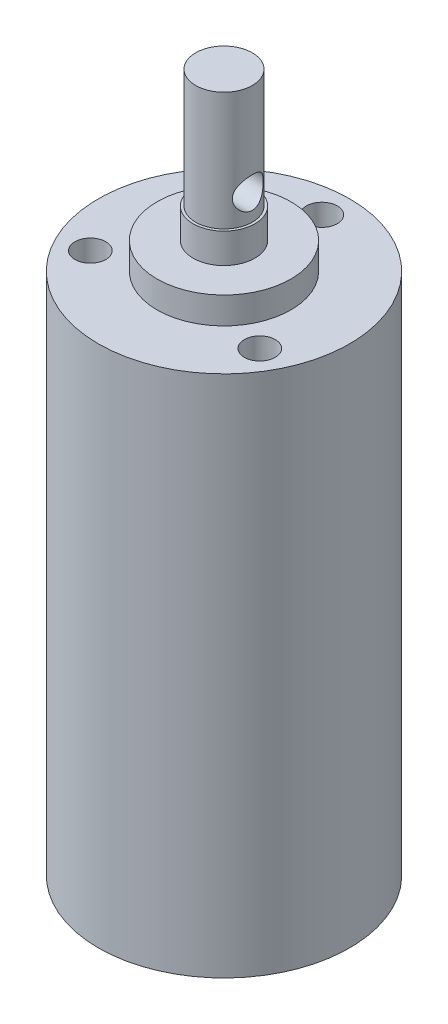
ISO-10303-21;
HEADER;
FILE_DESCRIPTION(('STEP AP214'),'2;1');
FILE_NAME('part.step','',(''),(''),'','','');
FILE_SCHEMA(('AUTOMOTIVE_DESIGN { 1 0 10303 214 1 1 1 1 }'));
ENDSEC;
DATA;
#1=APPLICATION_CONTEXT('core data for automotive mechanical design processes');
#2=APPLICATION_PROTOCOL_DEFINITION('international standard','automotive_design',2000,#1);
#3=PRODUCT_CONTEXT('',#1,'mechanical');
#4=PRODUCT('Part','Part','',(#3));
#5=PRODUCT_RELATED_PRODUCT_CATEGORY('part','',(#4));
#6=PRODUCT_DEFINITION_FORMATION('','',#4);
#7=PRODUCT_DEFINITION_CONTEXT('part definition',#1,'design');
#8=PRODUCT_DEFINITION('design','',#6,#7);
#9=PRODUCT_DEFINITION_SHAPE('','',#8);
#10=(LENGTH_UNIT() NAMED_UNIT(*) SI_UNIT(.MILLI.,.METRE.));
#11=(NAMED_UNIT(*) PLANE_ANGLE_UNIT() SI_UNIT($,.RADIAN.));
#12=(NAMED_UNIT(*) SI_UNIT($,.STERADIAN.) SOLID_ANGLE_UNIT());
#13=UNCERTAINTY_MEASURE_WITH_UNIT(LENGTH_MEASURE(1.E-05),#10,'distance_accuracy_value','');
#14=(GEOMETRIC_REPRESENTATION_CONTEXT(3) GLOBAL_UNCERTAINTY_ASSIGNED_CONTEXT((#13)) GLOBAL_UNIT_ASSIGNED_CONTEXT((#10,
#11,#12)) REPRESENTATION_CONTEXT('',''));
#15=CARTESIAN_POINT('',(0.,0.,0.));
#16=DIRECTION('',(0.,0.,1.));
#17=DIRECTION('',(1.,0.,0.));
#18=AXIS2_PLACEMENT_3D('',#15,#16,#17);
#19=CARTESIAN_POINT('',(0.,67.8,0.));
#20=DIRECTION('',(0.,-1.,0.));
#21=DIRECTION('',(0.,0.,-1.));
#22=AXIS2_PLACEMENT_3D('',#19,#20,#21);
#23=CYLINDRICAL_SURFACE('',#22,2.75);
#24=CARTESIAN_POINT('',(0.,67.8,0.));
#25=DIRECTION('',(0.,1.,0.));
#26=DIRECTION('',(0.,0.,1.));
#27=AXIS2_PLACEMENT_3D('',#24,#25,#26);
#28=CIRCLE('',#27,2.75);
#29=CARTESIAN_POINT('',(0.,67.8,2.75));
#30=VERTEX_POINT('',#29);
#31=EDGE_CURVE('E87',#30,#30,#28,.T.);
#32=ORIENTED_EDGE('',*,*,#31,.F.);
#33=EDGE_LOOP('',(#32));
#34=FACE_BOUND('',#33,.T.);
#35=CARTESIAN_POINT('',(0.,56.3,0.));
#36=DIRECTION('',(0.,1.,0.));
#37=DIRECTION('',(0.,0.,1.));
#38=AXIS2_PLACEMENT_3D('',#35,#36,#37);
#39=CIRCLE('',#38,2.75);
#40=CARTESIAN_POINT('',(0.,56.3,2.75));
#41=VERTEX_POINT('',#40);
#42=EDGE_CURVE('E91',#41,#41,#39,.T.);
#43=ORIENTED_EDGE('',*,*,#42,.T.);
#44=EDGE_LOOP('',(#43));
#45=FACE_BOUND('',#44,.T.);
#46=CARTESIAN_POINT('',(-2.30488611432322,58.8,1.5));
#47=CARTESIAN_POINT('',(-2.30489421024473,58.8769977980649,1.49999413135081));
#48=CARTESIAN_POINT('',(-2.30880529285267,58.9540658902809,1.49403027924783));
#49=CARTESIAN_POINT('',(-2.32384224007239,59.1057419900936,1.47052310835782));
#50=CARTESIAN_POINT('',(-2.33498052302754,59.1803455305923,1.45295985764456));
#51=CARTESIAN_POINT('',(-2.3627764835554,59.3245969796457,1.40729873671328));
#52=CARTESIAN_POINT('',(-2.37940017833792,59.3942722700169,1.37926559118574));
#53=CARTESIAN_POINT('',(-2.41623891176822,59.5279055874096,1.31365953143235));
#54=CARTESIAN_POINT('',(-2.43645465582752,59.5918624877305,1.27608474278248));
#55=CARTESIAN_POINT('',(-2.48063952354997,59.7192329954211,1.18809985416578));
#56=CARTESIAN_POINT('',(-2.50478202629872,59.7819622932264,1.13678582957949));
#57=CARTESIAN_POINT('',(-2.55270819572039,59.8984721190416,1.02464718126841));
#58=CARTESIAN_POINT('',(-2.57649164378584,59.9522473806204,0.963817000999299));
#59=CARTESIAN_POINT('',(-2.62340283071844,60.0537692411497,0.828145519509229));
#60=CARTESIAN_POINT('',(-2.6463074970794,60.100629421275,0.752556357772134));
#61=CARTESIAN_POINT('',(-2.68653962553174,60.1806498309828,0.59308163087746));
#62=CARTESIAN_POINT('',(-2.70387126555191,60.2138203286184,0.509202342542045));
#63=CARTESIAN_POINT('',(-2.72973873797664,60.2626568710776,0.342815290452241));
#64=CARTESIAN_POINT('',(-2.73887971624644,60.2795361091152,0.260759956132088));
#65=CARTESIAN_POINT('',(-2.74963355912743,60.2993526041986,0.0945174753778761));
#66=CARTESIAN_POINT('',(-2.75125201680447,60.3023002195662,0.0103319595955322));
#67=CARTESIAN_POINT('',(-2.74701957382299,60.2945300971072,-0.148463273203005));
#68=CARTESIAN_POINT('',(-2.74192108417944,60.2851890536892,-0.22316591496865));
#69=CARTESIAN_POINT('',(-2.72602671127768,60.2556361865413,-0.369747996654057));
#70=CARTESIAN_POINT('',(-2.71523039181036,60.2354235305104,-0.441627219968467));
#71=CARTESIAN_POINT('',(-2.6887521363836,60.1846876708578,-0.581590054068012));
#72=CARTESIAN_POINT('',(-2.6730172005102,60.1540522987458,-0.649622561481076));
#73=CARTESIAN_POINT('',(-2.6380078811625,60.0835578728626,-0.779717351324893));
#74=CARTESIAN_POINT('',(-2.61873234990232,60.0436958269064,-0.841777687733634));
#75=CARTESIAN_POINT('',(-2.57594789072271,59.9510318354158,-0.965247684465643));
#76=CARTESIAN_POINT('',(-2.55220670898869,59.897303020431,-1.0258813450631));
#77=CARTESIAN_POINT('',(-2.5043506209711,59.7808625228693,-1.13773322094231));
#78=CARTESIAN_POINT('',(-2.48023536122881,59.7181418165397,-1.18894185846822));
#79=CARTESIAN_POINT('',(-2.43203284519694,59.5790344299894,-1.28484880406853));
#80=CARTESIAN_POINT('',(-2.40812394765972,59.5019380431115,-1.32861732314198));
#81=CARTESIAN_POINT('',(-2.36600204452007,59.339947241466,-1.40226549882536));
#82=CARTESIAN_POINT('',(-2.34778248453195,59.2550619469109,-1.43216115707827));
#83=CARTESIAN_POINT('',(-2.3213279168276,59.0869919382089,-1.47462584067532));
#84=CARTESIAN_POINT('',(-2.31240382292294,59.0042261970102,-1.48840195774999));
#85=CARTESIAN_POINT('',(-2.30368170332884,58.8371151641062,-1.50187468275518));
#86=CARTESIAN_POINT('',(-2.30387370470172,58.752771699428,-1.50158667671771));
#87=CARTESIAN_POINT('',(-2.3126305306804,58.5977504765257,-1.48804477103613));
#88=CARTESIAN_POINT('',(-2.3200042154775,58.526830851057,-1.47663524601723));
#89=CARTESIAN_POINT('',(-2.34039421161149,58.3881045531662,-1.4440986516865));
#90=CARTESIAN_POINT('',(-2.35341292151871,58.3202992175645,-1.42296745140319));
#91=CARTESIAN_POINT('',(-2.38424525155975,58.1863511638695,-1.37070327109686));
#92=CARTESIAN_POINT('',(-2.40224030430736,58.1204039333396,-1.3391807933206));
#93=CARTESIAN_POINT('',(-2.44089767814822,57.9943400205406,-1.2673522456141));
#94=CARTESIAN_POINT('',(-2.46156132917246,57.9342262718031,-1.22704178914012));
#95=CARTESIAN_POINT('',(-2.50707449046941,57.8117483573317,-1.13149902493738));
#96=CARTESIAN_POINT('',(-2.53207564414213,57.7504849185977,-1.07492150821779));
#97=CARTESIAN_POINT('',(-2.58077925000358,57.6378900767564,-0.952074999249052));
#98=CARTESIAN_POINT('',(-2.60448096812037,57.5865642469523,-0.885800605073053));
#99=CARTESIAN_POINT('',(-2.64932207741289,57.4930289871697,-0.741333475405952));
#100=CARTESIAN_POINT('',(-2.67028379015716,57.4513756254632,-0.66272126620191));
#101=CARTESIAN_POINT('',(-2.70581165423852,57.3823268101038,-0.498139546402617));
#102=CARTESIAN_POINT('',(-2.72038436754133,57.3549167221888,-0.41217769341101));
#103=CARTESIAN_POINT('',(-2.74025647456966,57.3178658513127,-0.244694259646495));
#104=CARTESIAN_POINT('',(-2.74634426689625,57.3067091100237,-0.16360202677512));
#105=CARTESIAN_POINT('',(-2.75120766093104,57.2977813847802,-0.000479702749208387));
#106=CARTESIAN_POINT('',(-2.74998697472649,57.3000036054508,0.0815498911768346));
#107=CARTESIAN_POINT('',(-2.7408062740845,57.316908745602,0.236627195915174));
#108=CARTESIAN_POINT('',(-2.73344230866801,57.330489862266,0.309835076654739));
#109=CARTESIAN_POINT('',(-2.71343280563989,57.3680538636079,0.452760156657299));
#110=CARTESIAN_POINT('',(-2.70078662768826,57.3920380094141,0.522476931560599));
#111=CARTESIAN_POINT('',(-2.67075918156193,57.4505165984999,0.659259830973583));
#112=CARTESIAN_POINT('',(-2.65322685931173,57.4853513971162,0.726146176296634));
#113=CARTESIAN_POINT('',(-2.61509254701012,57.5641213309472,0.853350781635767));
#114=CARTESIAN_POINT('',(-2.59448929214413,57.6080602187548,0.913666317553954));
#115=CARTESIAN_POINT('',(-2.54937874301812,57.7095281177023,1.03329759578331));
#116=CARTESIAN_POINT('',(-2.52469397477493,57.7680345859653,1.09171873998498));
#117=CARTESIAN_POINT('',(-2.47586448118113,57.8940322711402,1.19835006802306));
#118=CARTESIAN_POINT('',(-2.45172042730756,57.9615340064524,1.24654812408244));
#119=CARTESIAN_POINT('',(-2.40519083827525,58.1088891232151,1.33423124165438));
#120=CARTESIAN_POINT('',(-2.38301155100028,58.1892524497921,1.37297721552887));
#121=CARTESIAN_POINT('',(-2.34568463982656,58.3569125658519,1.43583608451423));
#122=CARTESIAN_POINT('',(-2.3305144527591,58.4441860327815,1.45999601205782));
#123=CARTESIAN_POINT('',(-2.31521887971068,58.5771714506106,1.48402805225692));
#124=CARTESIAN_POINT('',(-2.3113659920565,58.6214279281973,1.49000328847283));
#125=CARTESIAN_POINT('',(-2.30619725664355,58.7104483431044,1.49799096623255));
#126=CARTESIAN_POINT('',(-2.30488140512533,58.7552122796727,1.50000341364851));
#127=CARTESIAN_POINT('',(-2.30488611432322,58.8,1.5));
#128=B_SPLINE_CURVE_WITH_KNOTS('',3,(#46,#47,#48,#49,#50,#51,#52,#53,#54,#55,#56,#57,#58,#59,
#60,#61,#62,#63,#64,#65,#66,#67,#68,#69,#70,#71,#72,#73,#74,#75,#76,#77,#78,#79,#80,#81,#82,#83,
#84,#85,#86,#87,#88,#89,#90,#91,#92,#93,#94,#95,#96,#97,#98,#99,#100,#101,#102,#103,#104,#105,
#106,#107,#108,#109,#110,#111,#112,#113,#114,#115,#116,#117,#118,#119,#120,#121,#122,#123,#124,
#125,#126,#127),.UNSPECIFIED.,.T.,.F.,(4,2,2,2,2,2,2,2,2,2,2,2,2,2,2,2,2,2,2,2,2,2,2,2,2,2,2,2,
2,2,2,2,2,2,2,2,2,2,2,2,4),(0.,0.230803470997661,0.462004580637979,0.69179945076113,
0.921639498290496,1.17429770256349,1.42710399005606,1.70115561989817,1.97500131995359,
2.22637200026068,2.47755575413936,2.70285922756718,2.92817995206935,3.15600657629093,
3.38390718783626,3.63612516342407,3.88859804585918,4.16263764047266,4.43636035373904,
4.68791635355979,4.93919715941132,5.15484596364109,5.37058648694267,5.59556414270452,
5.82065435485591,6.08070639443117,6.34090385904456,6.6135949958041,6.88600539910122,
7.13088300011669,7.37563623463373,7.5990787534829,7.82254836717644,8.05388690243173,
8.28532098294443,8.54308768651386,8.8011584924789,9.07546804719125,9.34888830494877,
9.48314119122964,9.6173938785714),.UNSPECIFIED.);
#129=CARTESIAN_POINT('',(-2.30488611432322,58.8,1.5));
#130=VERTEX_POINT('',#129);
#131=EDGE_CURVE('E52',#130,#130,#128,.T.);
#132=ORIENTED_EDGE('',*,*,#131,.F.);
#133=EDGE_LOOP('',(#132));
#134=FACE_BOUND('',#133,.T.);
#135=CARTESIAN_POINT('',(2.30488611432322,58.8,1.5));
#136=CARTESIAN_POINT('',(2.30489421024473,58.7230022019351,1.49999413135081));
#137=CARTESIAN_POINT('',(2.30880529285267,58.6459341097191,1.49403027924783));
#138=CARTESIAN_POINT('',(2.32384224007239,58.4942580099064,1.47052310835782));
#139=CARTESIAN_POINT('',(2.33498052302754,58.4196544694076,1.45295985764456));
#140=CARTESIAN_POINT('',(2.3627764835554,58.2754030203543,1.40729873671328));
#141=CARTESIAN_POINT('',(2.37940017833792,58.2057277299831,1.37926559118574));
#142=CARTESIAN_POINT('',(2.41623891176822,58.0720944125904,1.31365953143235));
#143=CARTESIAN_POINT('',(2.43645465582752,58.0081375122695,1.27608474278248));
#144=CARTESIAN_POINT('',(2.48063952354997,57.8807670045789,1.18809985416578));
#145=CARTESIAN_POINT('',(2.50478202629872,57.8180377067736,1.13678582957949));
#146=CARTESIAN_POINT('',(2.55270819572039,57.7015278809584,1.0246471812684));
#147=CARTESIAN_POINT('',(2.57649164378584,57.6477526193796,0.963817000999298));
#148=CARTESIAN_POINT('',(2.62340283071844,57.5462307588503,0.828145519509229));
#149=CARTESIAN_POINT('',(2.6463074970794,57.499370578725,0.752556357772134));
#150=CARTESIAN_POINT('',(2.68653962553174,57.4193501690172,0.59308163087746));
#151=CARTESIAN_POINT('',(2.70387126555191,57.3861796713815,0.509202342542045));
#152=CARTESIAN_POINT('',(2.72973873797664,57.3373431289224,0.342815290452241));
#153=CARTESIAN_POINT('',(2.73887971624644,57.3204638908848,0.260759956132088));
#154=CARTESIAN_POINT('',(2.74963355912743,57.3006473958014,0.094517475377876));
#155=CARTESIAN_POINT('',(2.75125201680447,57.2976997804338,0.0103319595955322));
#156=CARTESIAN_POINT('',(2.74701957382299,57.3054699028928,-0.148463273203005));
#157=CARTESIAN_POINT('',(2.74192108417944,57.3148109463108,-0.22316591496865));
#158=CARTESIAN_POINT('',(2.72602671127768,57.3443638134587,-0.369747996654057));
#159=CARTESIAN_POINT('',(2.71523039181036,57.3645764694896,-0.441627219968467));
#160=CARTESIAN_POINT('',(2.6887521363836,57.4153123291422,-0.581590054068012));
#161=CARTESIAN_POINT('',(2.6730172005102,57.4459477012542,-0.649622561481076));
#162=CARTESIAN_POINT('',(2.6380078811625,57.5164421271374,-0.779717351324893));
#163=CARTESIAN_POINT('',(2.61873234990232,57.5563041730936,-0.841777687733634));
#164=CARTESIAN_POINT('',(2.57594789072271,57.6489681645841,-0.965247684465641));
#165=CARTESIAN_POINT('',(2.55220670898869,57.702696979569,-1.0258813450631));
#166=CARTESIAN_POINT('',(2.5043506209711,57.8191374771307,-1.13773322094231));
#167=CARTESIAN_POINT('',(2.48023536122881,57.8818581834602,-1.18894185846822));
#168=CARTESIAN_POINT('',(2.43203284519694,58.0209655700106,-1.28484880406853));
#169=CARTESIAN_POINT('',(2.40812394765972,58.0980619568885,-1.32861732314198));
#170=CARTESIAN_POINT('',(2.36600204452007,58.260052758534,-1.40226549882536));
#171=CARTESIAN_POINT('',(2.34778248453195,58.3449380530891,-1.43216115707827));
#172=CARTESIAN_POINT('',(2.3213279168276,58.5130080617911,-1.47462584067532));
#173=CARTESIAN_POINT('',(2.31240382292294,58.5957738029897,-1.48840195774999));
#174=CARTESIAN_POINT('',(2.30368170332884,58.7628848358938,-1.50187468275518));
#175=CARTESIAN_POINT('',(2.30387370470172,58.847228300572,-1.50158667671771));
#176=CARTESIAN_POINT('',(2.3126305306804,59.0022495234743,-1.48804477103613));
#177=CARTESIAN_POINT('',(2.3200042154775,59.073169148943,-1.47663524601723));
#178=CARTESIAN_POINT('',(2.34039421161149,59.2118954468338,-1.4440986516865));
#179=CARTESIAN_POINT('',(2.35341292151871,59.2797007824355,-1.42296745140319));
#180=CARTESIAN_POINT('',(2.38424525155975,59.4136488361305,-1.37070327109686));
#181=CARTESIAN_POINT('',(2.40224030430736,59.4795960666604,-1.3391807933206));
#182=CARTESIAN_POINT('',(2.44089767814822,59.6056599794594,-1.2673522456141));
#183=CARTESIAN_POINT('',(2.46156132917246,59.6657737281969,-1.22704178914012));
#184=CARTESIAN_POINT('',(2.50707449046941,59.7882516426683,-1.13149902493738));
#185=CARTESIAN_POINT('',(2.53207564414213,59.8495150814023,-1.07492150821779));
#186=CARTESIAN_POINT('',(2.58077925000358,59.9621099232436,-0.952074999249052));
#187=CARTESIAN_POINT('',(2.60448096812037,60.0134357530477,-0.885800605073053));
#188=CARTESIAN_POINT('',(2.64932207741289,60.1069710128303,-0.741333475405952));
#189=CARTESIAN_POINT('',(2.67028379015716,60.1486243745368,-0.66272126620191));
#190=CARTESIAN_POINT('',(2.70581165423852,60.2176731898962,-0.498139546402617));
#191=CARTESIAN_POINT('',(2.72038436754133,60.2450832778112,-0.41217769341101));
#192=CARTESIAN_POINT('',(2.74025647456966,60.2821341486873,-0.244694259646495));
#193=CARTESIAN_POINT('',(2.74634426689625,60.2932908899763,-0.16360202677512));
#194=CARTESIAN_POINT('',(2.75120766093104,60.3022186152198,-0.000479702749208401));
#195=CARTESIAN_POINT('',(2.74998697472649,60.2999963945492,0.0815498911768345));
#196=CARTESIAN_POINT('',(2.7408062740845,60.283091254398,0.236627195915175));
#197=CARTESIAN_POINT('',(2.73344230866802,60.269510137734,0.30983507665474));
#198=CARTESIAN_POINT('',(2.71343280563989,60.2319461363921,0.4527601566573));
#199=CARTESIAN_POINT('',(2.70078662768826,60.2079619905859,0.5224769315606));
#200=CARTESIAN_POINT('',(2.67075918156193,60.1494834015001,0.659259830973585));
#201=CARTESIAN_POINT('',(2.65322685931173,60.1146486028837,0.726146176296638));
#202=CARTESIAN_POINT('',(2.61509254701012,60.0358786690528,0.85335078163577));
#203=CARTESIAN_POINT('',(2.59448929214413,59.9919397812452,0.913666317553956));
#204=CARTESIAN_POINT('',(2.54937874301812,59.8904718822977,1.03329759578331));
#205=CARTESIAN_POINT('',(2.52469397477493,59.8319654140347,1.09171873998498));
#206=CARTESIAN_POINT('',(2.47586448118113,59.7059677288598,1.19835006802306));
#207=CARTESIAN_POINT('',(2.45172042730756,59.6384659935475,1.24654812408244));
#208=CARTESIAN_POINT('',(2.40519083827525,59.4911108767849,1.33423124165438));
#209=CARTESIAN_POINT('',(2.38301155100028,59.4107475502079,1.37297721552887));
#210=CARTESIAN_POINT('',(2.34568463982656,59.2430874341481,1.43583608451423));
#211=CARTESIAN_POINT('',(2.3305144527591,59.1558139672185,1.45999601205782));
#212=CARTESIAN_POINT('',(2.31521887971068,59.0228285493894,1.48402805225692));
#213=CARTESIAN_POINT('',(2.3113659920565,58.9785720718027,1.49000328847283));
#214=CARTESIAN_POINT('',(2.30619725664355,58.8895516568956,1.49799096623255));
#215=CARTESIAN_POINT('',(2.30488140512533,58.8447877203273,1.50000341364851));
#216=CARTESIAN_POINT('',(2.30488611432322,58.8,1.5));
#217=B_SPLINE_CURVE_WITH_KNOTS('',3,(#135,#136,#137,#138,#139,#140,#141,#142,#143,#144,#145,
#146,#147,#148,#149,#150,#151,#152,#153,#154,#155,#156,#157,#158,#159,#160,#161,#162,#163,#164,
#165,#166,#167,#168,#169,#170,#171,#172,#173,#174,#175,#176,#177,#178,#179,#180,#181,#182,#183,
#184,#185,#186,#187,#188,#189,#190,#191,#192,#193,#194,#195,#196,#197,#198,#199,#200,#201,#202,
#203,#204,#205,#206,#207,#208,#209,#210,#211,#212,#213,#214,#215,#216),.UNSPECIFIED.,.T.,.F.,(4,
2,2,2,2,2,2,2,2,2,2,2,2,2,2,2,2,2,2,2,2,2,2,2,2,2,2,2,2,2,2,2,2,2,2,2,2,2,2,2,4),(0.,
0.230803470997661,0.462004580637979,0.69179945076113,0.921639498290496,1.1742977025635,
1.42710399005606,1.70115561989817,1.97500131995359,2.22637200026068,2.47755575413936,
2.70285922756718,2.92817995206935,3.15600657629093,3.38390718783626,3.63612516342407,
3.88859804585918,4.16263764047266,4.43636035373904,4.68791635355979,4.93919715941132,
5.15484596364109,5.37058648694267,5.59556414270452,5.82065435485591,6.08070639443117,
6.34090385904456,6.6135949958041,6.88600539910122,7.13088300011669,7.37563623463373,
7.5990787534829,7.82254836717644,8.05388690243173,8.28532098294443,8.54308768651385,
8.8011584924789,9.07546804719125,9.34888830494877,9.48314119122964,9.6173938785714),.UNSPECIFIED.);
#218=CARTESIAN_POINT('',(2.30488611432322,58.8,1.5));
#219=VERTEX_POINT('',#218);
#220=EDGE_CURVE('E36',#219,#219,#217,.T.);
#221=ORIENTED_EDGE('',*,*,#220,.F.);
#222=EDGE_LOOP('',(#221));
#223=FACE_BOUND('',#222,.T.);
#224=ADVANCED_FACE('F32',(#34,#45,#134,#223),#23,.T.);
#225=CARTESIAN_POINT('',(0.,50.8,0.));
#226=DIRECTION('',(0.,-1.,0.));
#227=DIRECTION('',(0.,0.,-1.));
#228=AXIS2_PLACEMENT_3D('',#225,#226,#227);
#229=CYLINDRICAL_SURFACE('',#228,12.2);
#230=CARTESIAN_POINT('',(0.,50.8,0.));
#231=DIRECTION('',(0.,1.,0.));
#232=DIRECTION('',(0.,0.,1.));
#233=AXIS2_PLACEMENT_3D('',#230,#231,#232);
#234=CIRCLE('',#233,12.2);
#235=CARTESIAN_POINT('',(0.,50.8,12.2));
#236=VERTEX_POINT('',#235);
#237=EDGE_CURVE('E44',#236,#236,#234,.T.);
#238=ORIENTED_EDGE('',*,*,#237,.F.);
#239=EDGE_LOOP('',(#238));
#240=FACE_BOUND('',#239,.T.);
#241=CARTESIAN_POINT('',(0.,0.,0.));
#242=DIRECTION('',(0.,1.,0.));
#243=DIRECTION('',(0.,0.,1.));
#244=AXIS2_PLACEMENT_3D('',#241,#242,#243);
#245=CIRCLE('',#244,12.2);
#246=CARTESIAN_POINT('',(0.,0.,12.2));
#247=VERTEX_POINT('',#246);
#248=EDGE_CURVE('E49',#247,#247,#245,.T.);
#249=ORIENTED_EDGE('',*,*,#248,.T.);
#250=EDGE_LOOP('',(#249));
#251=FACE_BOUND('',#250,.T.);
#252=ADVANCED_FACE('F34',(#240,#251),#229,.T.);
#253=CARTESIAN_POINT('',(0.,50.8,0.));
#254=DIRECTION('',(0.,1.,0.));
#255=DIRECTION('',(0.,0.,1.));
#256=AXIS2_PLACEMENT_3D('',#253,#254,#255);
#257=PLANE('',#256);
#258=CARTESIAN_POINT('',(8.22724133595277,50.8,4.74999999999965));
#259=DIRECTION('',(0.,1.,0.));
#260=DIRECTION('',(0.,0.,1.));
#261=AXIS2_PLACEMENT_3D('',#258,#259,#260);
#262=CIRCLE('',#261,1.50000000000052);
#263=CARTESIAN_POINT('',(8.22724133595277,50.8,6.25000000000017));
#264=VERTEX_POINT('',#263);
#265=EDGE_CURVE('E253',#264,#264,#262,.T.);
#266=ORIENTED_EDGE('',*,*,#265,.F.);
#267=EDGE_LOOP('',(#266));
#268=FACE_BOUND('',#267,.T.);
#269=CARTESIAN_POINT('',(-8.22724133595156,50.8,4.75000000000035));
#270=DIRECTION('',(0.,1.,0.));
#271=DIRECTION('',(0.,0.,1.));
#272=AXIS2_PLACEMENT_3D('',#269,#270,#271);
#273=CIRCLE('',#272,1.50000000000077);
#274=CARTESIAN_POINT('',(-8.22724133595156,50.8,6.25000000000112));
#275=VERTEX_POINT('',#274);
#276=EDGE_CURVE('E262',#275,#275,#273,.T.);
#277=ORIENTED_EDGE('',*,*,#276,.F.);
#278=EDGE_LOOP('',(#277));
#279=FACE_BOUND('',#278,.T.);
#280=CARTESIAN_POINT('',(0.,50.8,-9.5));
#281=DIRECTION('',(0.,1.,0.));
#282=DIRECTION('',(0.,0.,1.));
#283=AXIS2_PLACEMENT_3D('',#280,#281,#282);
#284=CIRCLE('',#283,1.5);
#285=CARTESIAN_POINT('',(0.,50.8,-8.));
#286=VERTEX_POINT('',#285);
#287=EDGE_CURVE('E252',#286,#286,#284,.T.);
#288=ORIENTED_EDGE('',*,*,#287,.F.);
#289=EDGE_LOOP('',(#288));
#290=FACE_BOUND('',#289,.T.);
#291=CARTESIAN_POINT('',(0.,50.8,0.));
#292=DIRECTION('',(0.,1.,0.));
#293=DIRECTION('',(0.,0.,1.));
#294=AXIS2_PLACEMENT_3D('',#291,#292,#293);
#295=CIRCLE('',#294,6.5);
#296=CARTESIAN_POINT('',(0.,50.8,6.5));
#297=VERTEX_POINT('',#296);
#298=EDGE_CURVE('E105',#297,#297,#295,.T.);
#299=ORIENTED_EDGE('',*,*,#298,.F.);
#300=EDGE_LOOP('',(#299));
#301=FACE_BOUND('',#300,.T.);
#302=ORIENTED_EDGE('',*,*,#237,.T.);
#303=EDGE_LOOP('',(#302));
#304=FACE_BOUND('',#303,.T.);
#305=ADVANCED_FACE('F83',(#268,#279,#290,#301,#304),#257,.T.);
#306=CARTESIAN_POINT('',(0.,0.,0.));
#307=DIRECTION('',(0.,1.,0.));
#308=DIRECTION('',(0.,0.,1.));
#309=AXIS2_PLACEMENT_3D('',#306,#307,#308);
#310=PLANE('',#309);
#311=CARTESIAN_POINT('',(0.,0.,0.));
#312=DIRECTION('',(0.,1.,0.));
#313=DIRECTION('',(0.,0.,1.));
#314=AXIS2_PLACEMENT_3D('',#311,#312,#313);
#315=CIRCLE('',#314,2.75);
#316=CARTESIAN_POINT('',(0.,0.,2.75));
#317=VERTEX_POINT('',#316);
#318=EDGE_CURVE('E10',#317,#317,#315,.F.);
#319=ORIENTED_EDGE('',*,*,#318,.F.);
#320=EDGE_LOOP('',(#319));
#321=FACE_BOUND('',#320,.T.);
#322=ORIENTED_EDGE('',*,*,#248,.F.);
#323=EDGE_LOOP('',(#322));
#324=FACE_BOUND('',#323,.T.);
#325=ADVANCED_FACE('F121',(#321,#324),#310,.F.);
#326=CARTESIAN_POINT('',(0.,-4.,0.));
#327=DIRECTION('',(0.,1.,0.));
#328=DIRECTION('',(0.,0.,1.));
#329=AXIS2_PLACEMENT_3D('',#326,#327,#328);
#330=CYLINDRICAL_SURFACE('',#329,2.75);
#331=CARTESIAN_POINT('',(0.,-4.,0.));
#332=DIRECTION('',(0.,-1.,0.));
#333=DIRECTION('',(0.,0.,-1.));
#334=AXIS2_PLACEMENT_3D('',#331,#332,#333);
#335=CIRCLE('',#334,2.75);
#336=CARTESIAN_POINT('',(0.,-4.,-2.75));
#337=VERTEX_POINT('',#336);
#338=EDGE_CURVE('E111',#337,#337,#335,.T.);
#339=ORIENTED_EDGE('',*,*,#338,.F.);
#340=EDGE_LOOP('',(#339));
#341=FACE_BOUND('',#340,.T.);
#342=ORIENTED_EDGE('',*,*,#318,.T.);
#343=EDGE_LOOP('',(#342));
#344=FACE_BOUND('',#343,.T.);
#345=ADVANCED_FACE('F123',(#341,#344),#330,.T.);
#346=CARTESIAN_POINT('',(0.,-4.,0.));
#347=DIRECTION('',(0.,-1.,0.));
#348=DIRECTION('',(0.,0.,-1.));
#349=AXIS2_PLACEMENT_3D('',#346,#347,#348);
#350=PLANE('',#349);
#351=ORIENTED_EDGE('',*,*,#338,.T.);
#352=EDGE_LOOP('',(#351));
#353=FACE_BOUND('',#352,.T.);
#354=ADVANCED_FACE('F129',(#353),#350,.T.);
#355=CARTESIAN_POINT('',(0.,53.4,0.));
#356=DIRECTION('',(0.,-1.,0.));
#357=DIRECTION('',(0.,0.,-1.));
#358=AXIS2_PLACEMENT_3D('',#355,#356,#357);
#359=CYLINDRICAL_SURFACE('',#358,6.5);
#360=CARTESIAN_POINT('',(0.,53.4,0.));
#361=DIRECTION('',(0.,1.,0.));
#362=DIRECTION('',(0.,0.,1.));
#363=AXIS2_PLACEMENT_3D('',#360,#361,#362);
#364=CIRCLE('',#363,6.5);
#365=CARTESIAN_POINT('',(0.,53.4,6.5));
#366=VERTEX_POINT('',#365);
#367=EDGE_CURVE('E108',#366,#366,#364,.T.);
#368=ORIENTED_EDGE('',*,*,#367,.F.);
#369=EDGE_LOOP('',(#368));
#370=FACE_BOUND('',#369,.T.);
#371=ORIENTED_EDGE('',*,*,#298,.T.);
#372=EDGE_LOOP('',(#371));
#373=FACE_BOUND('',#372,.T.);
#374=ADVANCED_FACE('F137',(#370,#373),#359,.T.);
#375=CARTESIAN_POINT('',(0.,53.4,0.));
#376=DIRECTION('',(0.,1.,0.));
#377=DIRECTION('',(0.,0.,1.));
#378=AXIS2_PLACEMENT_3D('',#375,#376,#377);
#379=PLANE('',#378);
#380=CARTESIAN_POINT('',(0.,53.4,0.));
#381=DIRECTION('',(0.,1.,0.));
#382=DIRECTION('',(0.,0.,1.));
#383=AXIS2_PLACEMENT_3D('',#380,#381,#382);
#384=CIRCLE('',#383,3.);
#385=CARTESIAN_POINT('',(0.,53.4,3.));
#386=VERTEX_POINT('',#385);
#387=EDGE_CURVE('E98',#386,#386,#384,.T.);
#388=ORIENTED_EDGE('',*,*,#387,.F.);
#389=EDGE_LOOP('',(#388));
#390=FACE_BOUND('',#389,.T.);
#391=ORIENTED_EDGE('',*,*,#367,.T.);
#392=EDGE_LOOP('',(#391));
#393=FACE_BOUND('',#392,.T.);
#394=ADVANCED_FACE('F140',(#390,#393),#379,.T.);
#395=CARTESIAN_POINT('',(0.,56.3,0.));
#396=DIRECTION('',(0.,-1.,0.));
#397=DIRECTION('',(0.,0.,-1.));
#398=AXIS2_PLACEMENT_3D('',#395,#396,#397);
#399=CYLINDRICAL_SURFACE('',#398,3.);
#400=CARTESIAN_POINT('',(0.,56.3,0.));
#401=DIRECTION('',(0.,1.,0.));
#402=DIRECTION('',(0.,0.,1.));
#403=AXIS2_PLACEMENT_3D('',#400,#401,#402);
#404=CIRCLE('',#403,3.);
#405=CARTESIAN_POINT('',(0.,56.3,3.));
#406=VERTEX_POINT('',#405);
#407=EDGE_CURVE('E102',#406,#406,#404,.T.);
#408=ORIENTED_EDGE('',*,*,#407,.F.);
#409=EDGE_LOOP('',(#408));
#410=FACE_BOUND('',#409,.T.);
#411=ORIENTED_EDGE('',*,*,#387,.T.);
#412=EDGE_LOOP('',(#411));
#413=FACE_BOUND('',#412,.T.);
#414=ADVANCED_FACE('F75',(#410,#413),#399,.T.);
#415=CARTESIAN_POINT('',(0.,56.3,0.));
#416=DIRECTION('',(0.,1.,0.));
#417=DIRECTION('',(0.,0.,1.));
#418=AXIS2_PLACEMENT_3D('',#415,#416,#417);
#419=PLANE('',#418);
#420=ORIENTED_EDGE('',*,*,#42,.F.);
#421=EDGE_LOOP('',(#420));
#422=FACE_BOUND('',#421,.T.);
#423=ORIENTED_EDGE('',*,*,#407,.T.);
#424=EDGE_LOOP('',(#423));
#425=FACE_BOUND('',#424,.T.);
#426=ADVANCED_FACE('F70',(#422,#425),#419,.T.);
#427=CARTESIAN_POINT('',(0.,67.8,0.));
#428=DIRECTION('',(0.,1.,0.));
#429=DIRECTION('',(0.,0.,1.));
#430=AXIS2_PLACEMENT_3D('',#427,#428,#429);
#431=PLANE('',#430);
#432=ORIENTED_EDGE('',*,*,#31,.T.);
#433=EDGE_LOOP('',(#432));
#434=FACE_BOUND('',#433,.T.);
#435=ADVANCED_FACE('F65',(#434),#431,.T.);
#436=CARTESIAN_POINT('',(11.5,58.8,0.));
#437=DIRECTION('',(-1.,0.,0.));
#438=DIRECTION('',(0.,0.,1.));
#439=AXIS2_PLACEMENT_3D('',#436,#437,#438);
#440=CYLINDRICAL_SURFACE('',#439,1.5);
#441=ORIENTED_EDGE('',*,*,#131,.T.);
#442=EDGE_LOOP('',(#441));
#443=FACE_BOUND('',#442,.T.);
#444=ORIENTED_EDGE('',*,*,#220,.T.);
#445=EDGE_LOOP('',(#444));
#446=FACE_BOUND('',#445,.T.);
#447=ADVANCED_FACE('F60',(#443,#446),#440,.F.);
#448=CARTESIAN_POINT('',(0.,39.3,-9.5));
#449=DIRECTION('',(0.,1.,0.));
#450=DIRECTION('',(0.,0.,1.));
#451=AXIS2_PLACEMENT_3D('',#448,#449,#450);
#452=CYLINDRICAL_SURFACE('',#451,1.5);
#453=CARTESIAN_POINT('',(0.,39.3,-9.5));
#454=DIRECTION('',(0.,1.,0.));
#455=DIRECTION('',(0.,0.,1.));
#456=AXIS2_PLACEMENT_3D('',#453,#454,#455);
#457=CIRCLE('',#456,1.5);
#458=CARTESIAN_POINT('',(0.,39.3,-8.));
#459=VERTEX_POINT('',#458);
#460=EDGE_CURVE('E56',#459,#459,#457,.T.);
#461=ORIENTED_EDGE('',*,*,#460,.F.);
#462=EDGE_LOOP('',(#461));
#463=FACE_BOUND('',#462,.T.);
#464=ORIENTED_EDGE('',*,*,#287,.T.);
#465=EDGE_LOOP('',(#464));
#466=FACE_BOUND('',#465,.T.);
#467=ADVANCED_FACE('F64',(#463,#466),#452,.F.);
#468=CARTESIAN_POINT('',(0.,39.3,-9.5));
#469=DIRECTION('',(0.,1.,0.));
#470=DIRECTION('',(0.,0.,1.));
#471=AXIS2_PLACEMENT_3D('',#468,#469,#470);
#472=PLANE('',#471);
#473=ORIENTED_EDGE('',*,*,#460,.T.);
#474=EDGE_LOOP('',(#473));
#475=FACE_BOUND('',#474,.T.);
#476=ADVANCED_FACE('F197',(#475),#472,.T.);
#477=CARTESIAN_POINT('',(-8.22724133595156,39.3,4.75000000000035));
#478=DIRECTION('',(0.,1.,0.));
#479=DIRECTION('',(0.,0.,1.));
#480=AXIS2_PLACEMENT_3D('',#477,#478,#479);
#481=CYLINDRICAL_SURFACE('',#480,1.50000000000077);
#482=CARTESIAN_POINT('',(-8.22724133595156,39.3,4.75000000000035));
#483=DIRECTION('',(0.,1.,0.));
#484=DIRECTION('',(0.,0.,1.));
#485=AXIS2_PLACEMENT_3D('',#482,#483,#484);
#486=CIRCLE('',#485,1.50000000000077);
#487=CARTESIAN_POINT('',(-8.22724133595156,39.3,6.25000000000112));
#488=VERTEX_POINT('',#487);
#489=EDGE_CURVE('E257',#488,#488,#486,.T.);
#490=ORIENTED_EDGE('',*,*,#489,.F.);
#491=EDGE_LOOP('',(#490));
#492=FACE_BOUND('',#491,.T.);
#493=ORIENTED_EDGE('',*,*,#276,.T.);
#494=EDGE_LOOP('',(#493));
#495=FACE_BOUND('',#494,.T.);
#496=ADVANCED_FACE('F206',(#492,#495),#481,.F.);
#497=CARTESIAN_POINT('',(-8.22724133595156,39.3,4.75000000000035));
#498=DIRECTION('',(0.,1.,0.));
#499=DIRECTION('',(0.,0.,1.));
#500=AXIS2_PLACEMENT_3D('',#497,#498,#499);
#501=PLANE('',#500);
#502=ORIENTED_EDGE('',*,*,#489,.T.);
#503=EDGE_LOOP('',(#502));
#504=FACE_BOUND('',#503,.T.);
#505=ADVANCED_FACE('F215',(#504),#501,.T.);
#506=CARTESIAN_POINT('',(8.22724133595277,39.3,4.74999999999965));
#507=DIRECTION('',(0.,1.,0.));
#508=DIRECTION('',(0.,0.,1.));
#509=AXIS2_PLACEMENT_3D('',#506,#507,#508);
#510=CYLINDRICAL_SURFACE('',#509,1.50000000000052);
#511=CARTESIAN_POINT('',(8.22724133595277,39.3,4.74999999999965));
#512=DIRECTION('',(0.,1.,0.));
#513=DIRECTION('',(0.,0.,1.));
#514=AXIS2_PLACEMENT_3D('',#511,#512,#513);
#515=CIRCLE('',#514,1.50000000000052);
#516=CARTESIAN_POINT('',(8.22724133595277,39.3,6.25000000000017));
#517=VERTEX_POINT('',#516);
#518=EDGE_CURVE('E251',#517,#517,#515,.T.);
#519=ORIENTED_EDGE('',*,*,#518,.F.);
#520=EDGE_LOOP('',(#519));
#521=FACE_BOUND('',#520,.T.);
#522=ORIENTED_EDGE('',*,*,#265,.T.);
#523=EDGE_LOOP('',(#522));
#524=FACE_BOUND('',#523,.T.);
#525=ADVANCED_FACE('F225',(#521,#524),#510,.F.);
#526=CARTESIAN_POINT('',(8.22724133595277,39.3,4.74999999999965));
#527=DIRECTION('',(0.,1.,0.));
#528=DIRECTION('',(0.,0.,1.));
#529=AXIS2_PLACEMENT_3D('',#526,#527,#528);
#530=PLANE('',#529);
#531=ORIENTED_EDGE('',*,*,#518,.T.);
#532=EDGE_LOOP('',(#531));
#533=FACE_BOUND('',#532,.T.);
#534=ADVANCED_FACE('F235',(#533),#530,.T.);
#535=CLOSED_SHELL('',(#224,#252,#305,#325,#345,#354,#374,#394,#414,#426,#435,#447,#467,#476,
#496,#505,#525,#534));
#536=MANIFOLD_SOLID_BREP('B2',#535);
#537=ADVANCED_BREP_SHAPE_REPRESENTATION('',(#18,#536),#14);
#538=SHAPE_DEFINITION_REPRESENTATION(#9,#537);
ENDSEC;
END-ISO-10303-21;
